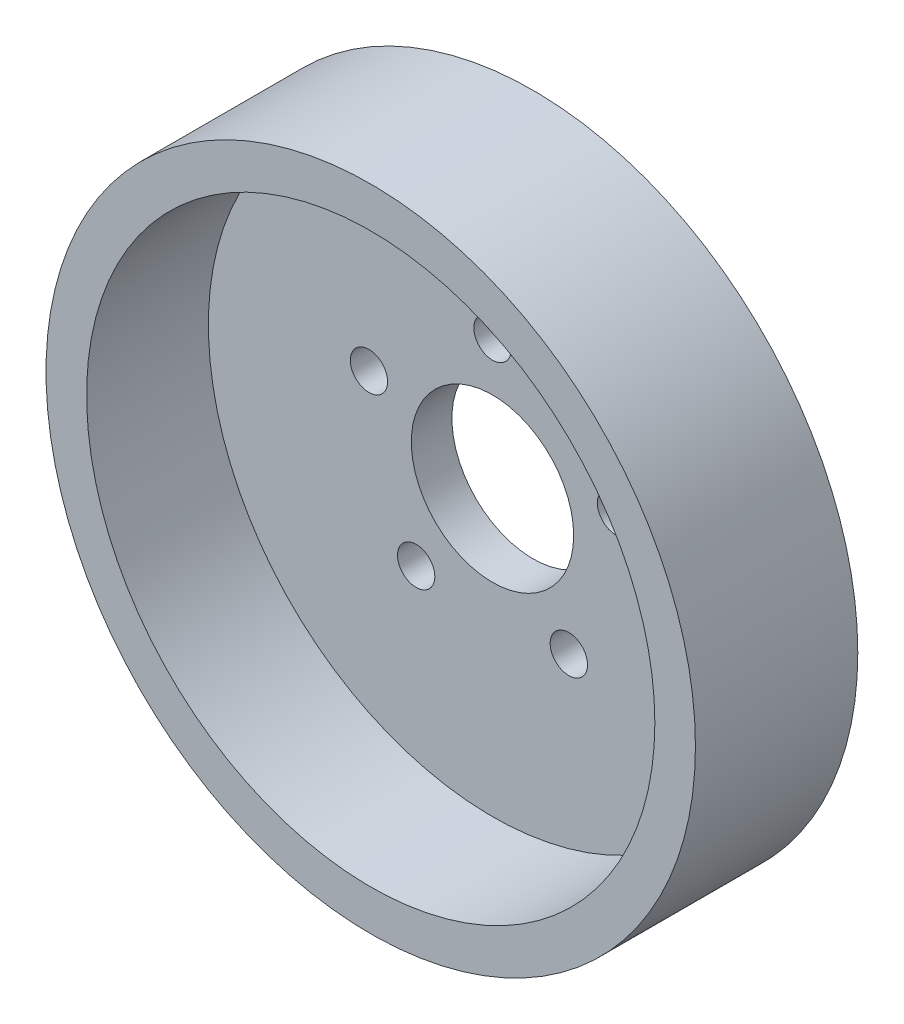
ISO-10303-21;
HEADER;
FILE_DESCRIPTION(('STEP AP214'),'2;1');
FILE_NAME('part.step','',(''),(''),'','','');
FILE_SCHEMA(('AUTOMOTIVE_DESIGN { 1 0 10303 214 1 1 1 1 }'));
ENDSEC;
DATA;
#1=APPLICATION_CONTEXT('core data for automotive mechanical design processes');
#2=APPLICATION_PROTOCOL_DEFINITION('international standard','automotive_design',2000,#1);
#3=PRODUCT_CONTEXT('',#1,'mechanical');
#4=PRODUCT('Part','Part','',(#3));
#5=PRODUCT_RELATED_PRODUCT_CATEGORY('part','',(#4));
#6=PRODUCT_DEFINITION_FORMATION('','',#4);
#7=PRODUCT_DEFINITION_CONTEXT('part definition',#1,'design');
#8=PRODUCT_DEFINITION('design','',#6,#7);
#9=PRODUCT_DEFINITION_SHAPE('','',#8);
#10=(LENGTH_UNIT() NAMED_UNIT(*) SI_UNIT(.MILLI.,.METRE.));
#11=(NAMED_UNIT(*) PLANE_ANGLE_UNIT() SI_UNIT($,.RADIAN.));
#12=(NAMED_UNIT(*) SI_UNIT($,.STERADIAN.) SOLID_ANGLE_UNIT());
#13=UNCERTAINTY_MEASURE_WITH_UNIT(LENGTH_MEASURE(1.E-05),#10,'distance_accuracy_value','');
#14=(GEOMETRIC_REPRESENTATION_CONTEXT(3) GLOBAL_UNCERTAINTY_ASSIGNED_CONTEXT((#13)) GLOBAL_UNIT_ASSIGNED_CONTEXT((#10,
#11,#12)) REPRESENTATION_CONTEXT('',''));
#15=CARTESIAN_POINT('',(0.,0.,0.));
#16=DIRECTION('',(0.,0.,1.));
#17=DIRECTION('',(1.,0.,0.));
#18=AXIS2_PLACEMENT_3D('',#15,#16,#17);
#19=CARTESIAN_POINT('',(0.,0.,25.4));
#20=DIRECTION('',(0.,0.,-1.));
#21=DIRECTION('',(-1.,0.,0.));
#22=AXIS2_PLACEMENT_3D('',#19,#20,#21);
#23=CYLINDRICAL_SURFACE('',#22,12.7);
#24=CARTESIAN_POINT('',(0.,0.,0.));
#25=DIRECTION('',(0.,0.,1.));
#26=DIRECTION('',(1.,0.,0.));
#27=AXIS2_PLACEMENT_3D('',#24,#25,#26);
#28=CIRCLE('',#27,12.7);
#29=CARTESIAN_POINT('',(12.7,0.,0.));
#30=VERTEX_POINT('',#29);
#31=EDGE_CURVE('E52',#30,#30,#28,.T.);
#32=ORIENTED_EDGE('',*,*,#31,.F.);
#33=EDGE_LOOP('',(#32));
#34=FACE_BOUND('',#33,.T.);
#35=CARTESIAN_POINT('',(0.,0.,6.35));
#36=DIRECTION('',(0.,0.,1.));
#37=DIRECTION('',(1.,0.,0.));
#38=AXIS2_PLACEMENT_3D('',#35,#36,#37);
#39=CIRCLE('',#38,12.7);
#40=CARTESIAN_POINT('',(12.7,0.,6.35));
#41=VERTEX_POINT('',#40);
#42=EDGE_CURVE('E77',#41,#41,#39,.T.);
#43=ORIENTED_EDGE('',*,*,#42,.T.);
#44=EDGE_LOOP('',(#43));
#45=FACE_BOUND('',#44,.T.);
#46=ADVANCED_FACE('F37',(#34,#45),#23,.F.);
#47=CARTESIAN_POINT('',(0.,20.32,25.4));
#48=DIRECTION('',(0.,0.,-1.));
#49=DIRECTION('',(-1.,0.,0.));
#50=AXIS2_PLACEMENT_3D('',#47,#48,#49);
#51=CYLINDRICAL_SURFACE('',#50,2.921);
#52=CARTESIAN_POINT('',(0.,20.32,0.));
#53=DIRECTION('',(0.,0.,1.));
#54=DIRECTION('',(1.,0.,0.));
#55=AXIS2_PLACEMENT_3D('',#52,#53,#54);
#56=CIRCLE('',#55,2.921);
#57=CARTESIAN_POINT('',(2.921,20.32,0.));
#58=VERTEX_POINT('',#57);
#59=EDGE_CURVE('E57',#58,#58,#56,.T.);
#60=ORIENTED_EDGE('',*,*,#59,.F.);
#61=EDGE_LOOP('',(#60));
#62=FACE_BOUND('',#61,.T.);
#63=CARTESIAN_POINT('',(0.,20.32,6.35));
#64=DIRECTION('',(0.,0.,1.));
#65=DIRECTION('',(1.,0.,0.));
#66=AXIS2_PLACEMENT_3D('',#63,#64,#65);
#67=CIRCLE('',#66,2.921);
#68=CARTESIAN_POINT('',(2.921,20.32,6.35));
#69=VERTEX_POINT('',#68);
#70=EDGE_CURVE('E81',#69,#69,#67,.T.);
#71=ORIENTED_EDGE('',*,*,#70,.T.);
#72=EDGE_LOOP('',(#71));
#73=FACE_BOUND('',#72,.T.);
#74=ADVANCED_FACE('F125',(#62,#73),#51,.F.);
#75=CARTESIAN_POINT('',(19.3254684111175,6.27922532569893,25.4));
#76=DIRECTION('',(0.,0.,-1.));
#77=DIRECTION('',(-1.,0.,0.));
#78=AXIS2_PLACEMENT_3D('',#75,#76,#77);
#79=CYLINDRICAL_SURFACE('',#78,2.921);
#80=CARTESIAN_POINT('',(19.3254684111175,6.27922532569893,0.));
#81=DIRECTION('',(0.,0.,1.));
#82=DIRECTION('',(1.,0.,0.));
#83=AXIS2_PLACEMENT_3D('',#80,#81,#82);
#84=CIRCLE('',#83,2.921);
#85=CARTESIAN_POINT('',(22.2464684111175,6.27922532569893,0.));
#86=VERTEX_POINT('',#85);
#87=EDGE_CURVE('E61',#86,#86,#84,.T.);
#88=ORIENTED_EDGE('',*,*,#87,.F.);
#89=EDGE_LOOP('',(#88));
#90=FACE_BOUND('',#89,.T.);
#91=CARTESIAN_POINT('',(19.3254684111175,6.27922532569893,6.35));
#92=DIRECTION('',(0.,0.,1.));
#93=DIRECTION('',(1.,0.,0.));
#94=AXIS2_PLACEMENT_3D('',#91,#92,#93);
#95=CIRCLE('',#94,2.921);
#96=CARTESIAN_POINT('',(22.2464684111175,6.27922532569893,6.35));
#97=VERTEX_POINT('',#96);
#98=EDGE_CURVE('E85',#97,#97,#95,.T.);
#99=ORIENTED_EDGE('',*,*,#98,.T.);
#100=EDGE_LOOP('',(#99));
#101=FACE_BOUND('',#100,.T.);
#102=ADVANCED_FACE('F131',(#90,#101),#79,.F.);
#103=CARTESIAN_POINT('',(11.9437963265831,-16.4392253256989,25.4));
#104=DIRECTION('',(0.,0.,-1.));
#105=DIRECTION('',(-1.,0.,0.));
#106=AXIS2_PLACEMENT_3D('',#103,#104,#105);
#107=CYLINDRICAL_SURFACE('',#106,2.921);
#108=CARTESIAN_POINT('',(11.9437963265831,-16.4392253256989,0.));
#109=DIRECTION('',(0.,0.,1.));
#110=DIRECTION('',(1.,0.,0.));
#111=AXIS2_PLACEMENT_3D('',#108,#109,#110);
#112=CIRCLE('',#111,2.921);
#113=CARTESIAN_POINT('',(14.8647963265831,-16.4392253256989,0.));
#114=VERTEX_POINT('',#113);
#115=EDGE_CURVE('E65',#114,#114,#112,.T.);
#116=ORIENTED_EDGE('',*,*,#115,.F.);
#117=EDGE_LOOP('',(#116));
#118=FACE_BOUND('',#117,.T.);
#119=CARTESIAN_POINT('',(11.9437963265831,-16.4392253256989,6.35));
#120=DIRECTION('',(0.,0.,1.));
#121=DIRECTION('',(1.,0.,0.));
#122=AXIS2_PLACEMENT_3D('',#119,#120,#121);
#123=CIRCLE('',#122,2.921);
#124=CARTESIAN_POINT('',(14.8647963265831,-16.4392253256989,6.35));
#125=VERTEX_POINT('',#124);
#126=EDGE_CURVE('E89',#125,#125,#123,.T.);
#127=ORIENTED_EDGE('',*,*,#126,.T.);
#128=EDGE_LOOP('',(#127));
#129=FACE_BOUND('',#128,.T.);
#130=ADVANCED_FACE('F167',(#118,#129),#107,.F.);
#131=CARTESIAN_POINT('',(-11.9437963265831,-16.4392253256989,25.4));
#132=DIRECTION('',(0.,0.,-1.));
#133=DIRECTION('',(-1.,0.,0.));
#134=AXIS2_PLACEMENT_3D('',#131,#132,#133);
#135=CYLINDRICAL_SURFACE('',#134,2.921);
#136=CARTESIAN_POINT('',(-11.9437963265831,-16.4392253256989,0.));
#137=DIRECTION('',(0.,0.,1.));
#138=DIRECTION('',(1.,0.,0.));
#139=AXIS2_PLACEMENT_3D('',#136,#137,#138);
#140=CIRCLE('',#139,2.921);
#141=CARTESIAN_POINT('',(-9.02279632658306,-16.4392253256989,0.));
#142=VERTEX_POINT('',#141);
#143=EDGE_CURVE('E69',#142,#142,#140,.T.);
#144=ORIENTED_EDGE('',*,*,#143,.F.);
#145=EDGE_LOOP('',(#144));
#146=FACE_BOUND('',#145,.T.);
#147=CARTESIAN_POINT('',(-11.9437963265831,-16.4392253256989,6.35));
#148=DIRECTION('',(0.,0.,1.));
#149=DIRECTION('',(1.,0.,0.));
#150=AXIS2_PLACEMENT_3D('',#147,#148,#149);
#151=CIRCLE('',#150,2.921);
#152=CARTESIAN_POINT('',(-9.02279632658306,-16.4392253256989,6.35));
#153=VERTEX_POINT('',#152);
#154=EDGE_CURVE('E93',#153,#153,#151,.T.);
#155=ORIENTED_EDGE('',*,*,#154,.T.);
#156=EDGE_LOOP('',(#155));
#157=FACE_BOUND('',#156,.T.);
#158=ADVANCED_FACE('F162',(#146,#157),#135,.F.);
#159=CARTESIAN_POINT('',(-19.3254684111175,6.27922532569893,25.4));
#160=DIRECTION('',(0.,0.,-1.));
#161=DIRECTION('',(-1.,0.,0.));
#162=AXIS2_PLACEMENT_3D('',#159,#160,#161);
#163=CYLINDRICAL_SURFACE('',#162,2.921);
#164=CARTESIAN_POINT('',(-19.3254684111175,6.27922532569893,0.));
#165=DIRECTION('',(0.,0.,1.));
#166=DIRECTION('',(1.,0.,0.));
#167=AXIS2_PLACEMENT_3D('',#164,#165,#166);
#168=CIRCLE('',#167,2.921);
#169=CARTESIAN_POINT('',(-16.4044684111175,6.27922532569893,0.));
#170=VERTEX_POINT('',#169);
#171=EDGE_CURVE('E73',#170,#170,#168,.T.);
#172=ORIENTED_EDGE('',*,*,#171,.F.);
#173=EDGE_LOOP('',(#172));
#174=FACE_BOUND('',#173,.T.);
#175=CARTESIAN_POINT('',(-19.3254684111175,6.27922532569893,6.35));
#176=DIRECTION('',(0.,0.,1.));
#177=DIRECTION('',(1.,0.,0.));
#178=AXIS2_PLACEMENT_3D('',#175,#176,#177);
#179=CIRCLE('',#178,2.921);
#180=CARTESIAN_POINT('',(-16.4044684111175,6.27922532569893,6.35));
#181=VERTEX_POINT('',#180);
#182=EDGE_CURVE('E41',#181,#181,#179,.T.);
#183=ORIENTED_EDGE('',*,*,#182,.T.);
#184=EDGE_LOOP('',(#183));
#185=FACE_BOUND('',#184,.T.);
#186=ADVANCED_FACE('F110',(#174,#185),#163,.F.);
#187=CARTESIAN_POINT('',(0.,0.,25.4));
#188=DIRECTION('',(0.,0.,1.));
#189=DIRECTION('',(1.,0.,0.));
#190=AXIS2_PLACEMENT_3D('',#187,#188,#189);
#191=PLANE('',#190);
#192=CARTESIAN_POINT('',(0.,0.,25.4));
#193=DIRECTION('',(0.,0.,1.));
#194=DIRECTION('',(1.,0.,0.));
#195=AXIS2_PLACEMENT_3D('',#192,#193,#194);
#196=CIRCLE('',#195,44.45);
#197=CARTESIAN_POINT('',(44.45,0.,25.4));
#198=VERTEX_POINT('',#197);
#199=EDGE_CURVE('E97',#198,#198,#196,.T.);
#200=ORIENTED_EDGE('',*,*,#199,.F.);
#201=EDGE_LOOP('',(#200));
#202=FACE_BOUND('',#201,.T.);
#203=CARTESIAN_POINT('',(0.,0.,25.4));
#204=DIRECTION('',(0.,0.,1.));
#205=DIRECTION('',(1.,0.,0.));
#206=AXIS2_PLACEMENT_3D('',#203,#204,#205);
#207=CIRCLE('',#206,50.8);
#208=CARTESIAN_POINT('',(50.8,0.,25.4));
#209=VERTEX_POINT('',#208);
#210=EDGE_CURVE('E10',#209,#209,#207,.T.);
#211=ORIENTED_EDGE('',*,*,#210,.T.);
#212=EDGE_LOOP('',(#211));
#213=FACE_BOUND('',#212,.T.);
#214=ADVANCED_FACE('F138',(#202,#213),#191,.T.);
#215=CARTESIAN_POINT('',(0.,0.,0.));
#216=DIRECTION('',(0.,0.,1.));
#217=DIRECTION('',(1.,0.,0.));
#218=AXIS2_PLACEMENT_3D('',#215,#216,#217);
#219=PLANE('',#218);
#220=CARTESIAN_POINT('',(0.,0.,0.));
#221=DIRECTION('',(0.,0.,1.));
#222=DIRECTION('',(1.,0.,0.));
#223=AXIS2_PLACEMENT_3D('',#220,#221,#222);
#224=CIRCLE('',#223,50.8);
#225=CARTESIAN_POINT('',(50.8,0.,0.));
#226=VERTEX_POINT('',#225);
#227=EDGE_CURVE('E46',#226,#226,#224,.T.);
#228=ORIENTED_EDGE('',*,*,#227,.F.);
#229=EDGE_LOOP('',(#228));
#230=FACE_BOUND('',#229,.T.);
#231=ORIENTED_EDGE('',*,*,#31,.T.);
#232=EDGE_LOOP('',(#231));
#233=FACE_BOUND('',#232,.T.);
#234=ORIENTED_EDGE('',*,*,#59,.T.);
#235=EDGE_LOOP('',(#234));
#236=FACE_BOUND('',#235,.T.);
#237=ORIENTED_EDGE('',*,*,#87,.T.);
#238=EDGE_LOOP('',(#237));
#239=FACE_BOUND('',#238,.T.);
#240=ORIENTED_EDGE('',*,*,#115,.T.);
#241=EDGE_LOOP('',(#240));
#242=FACE_BOUND('',#241,.T.);
#243=ORIENTED_EDGE('',*,*,#143,.T.);
#244=EDGE_LOOP('',(#243));
#245=FACE_BOUND('',#244,.T.);
#246=ORIENTED_EDGE('',*,*,#171,.T.);
#247=EDGE_LOOP('',(#246));
#248=FACE_BOUND('',#247,.T.);
#249=ADVANCED_FACE('F140',(#230,#233,#236,#239,#242,#245,#248),#219,.F.);
#250=CARTESIAN_POINT('',(0.,0.,25.4));
#251=DIRECTION('',(0.,0.,-1.));
#252=DIRECTION('',(-1.,0.,0.));
#253=AXIS2_PLACEMENT_3D('',#250,#251,#252);
#254=CYLINDRICAL_SURFACE('',#253,50.8);
#255=ORIENTED_EDGE('',*,*,#210,.F.);
#256=EDGE_LOOP('',(#255));
#257=FACE_BOUND('',#256,.T.);
#258=ORIENTED_EDGE('',*,*,#227,.T.);
#259=EDGE_LOOP('',(#258));
#260=FACE_BOUND('',#259,.T.);
#261=ADVANCED_FACE('F39',(#257,#260),#254,.T.);
#262=CARTESIAN_POINT('',(0.,0.,6.35));
#263=DIRECTION('',(0.,0.,1.));
#264=DIRECTION('',(1.,0.,0.));
#265=AXIS2_PLACEMENT_3D('',#262,#263,#264);
#266=CYLINDRICAL_SURFACE('',#265,44.45);
#267=CARTESIAN_POINT('',(0.,0.,6.35));
#268=DIRECTION('',(0.,0.,1.));
#269=DIRECTION('',(1.,0.,0.));
#270=AXIS2_PLACEMENT_3D('',#267,#268,#269);
#271=CIRCLE('',#270,44.45);
#272=CARTESIAN_POINT('',(44.45,0.,6.35));
#273=VERTEX_POINT('',#272);
#274=EDGE_CURVE('E101',#273,#273,#271,.T.);
#275=CARTESIAN_POINT('',(44.45,0.,6.35));
#276=CARTESIAN_POINT('',(44.45,0.,6.5484375));
#277=CARTESIAN_POINT('',(44.45,0.,6.746875));
#278=CARTESIAN_POINT('',(44.45,0.,7.14375));
#279=CARTESIAN_POINT('',(44.45,0.,7.3421875));
#280=CARTESIAN_POINT('',(44.45,0.,7.7390625));
#281=CARTESIAN_POINT('',(44.45,0.,7.9375));
#282=CARTESIAN_POINT('',(44.45,0.,8.334375));
#283=CARTESIAN_POINT('',(44.45,0.,8.5328125));
#284=CARTESIAN_POINT('',(44.45,0.,8.9296875));
#285=CARTESIAN_POINT('',(44.45,0.,9.128125));
#286=CARTESIAN_POINT('',(44.45,0.,9.525));
#287=CARTESIAN_POINT('',(44.45,0.,9.7234375));
#288=CARTESIAN_POINT('',(44.45,0.,10.1203125));
#289=CARTESIAN_POINT('',(44.45,0.,10.31875));
#290=CARTESIAN_POINT('',(44.45,0.,10.715625));
#291=CARTESIAN_POINT('',(44.45,0.,10.9140625));
#292=CARTESIAN_POINT('',(44.45,0.,11.3109375));
#293=CARTESIAN_POINT('',(44.45,0.,11.509375));
#294=CARTESIAN_POINT('',(44.45,0.,11.90625));
#295=CARTESIAN_POINT('',(44.45,0.,12.1046875));
#296=CARTESIAN_POINT('',(44.45,0.,12.5015625));
#297=CARTESIAN_POINT('',(44.45,0.,12.7));
#298=CARTESIAN_POINT('',(44.45,0.,13.096875));
#299=CARTESIAN_POINT('',(44.45,0.,13.2953125));
#300=CARTESIAN_POINT('',(44.45,0.,13.6921875));
#301=CARTESIAN_POINT('',(44.45,0.,13.890625));
#302=CARTESIAN_POINT('',(44.45,0.,14.2875));
#303=CARTESIAN_POINT('',(44.45,0.,14.4859375));
#304=CARTESIAN_POINT('',(44.45,0.,14.8828125));
#305=CARTESIAN_POINT('',(44.45,0.,15.08125));
#306=CARTESIAN_POINT('',(44.45,0.,15.478125));
#307=CARTESIAN_POINT('',(44.45,0.,15.6765625));
#308=CARTESIAN_POINT('',(44.45,0.,16.0734375));
#309=CARTESIAN_POINT('',(44.45,0.,16.271875));
#310=CARTESIAN_POINT('',(44.45,0.,16.66875));
#311=CARTESIAN_POINT('',(44.45,0.,16.8671875));
#312=CARTESIAN_POINT('',(44.45,0.,17.2640625));
#313=CARTESIAN_POINT('',(44.45,0.,17.4625));
#314=CARTESIAN_POINT('',(44.45,0.,17.859375));
#315=CARTESIAN_POINT('',(44.45,0.,18.0578125));
#316=CARTESIAN_POINT('',(44.45,0.,18.4546875));
#317=CARTESIAN_POINT('',(44.45,0.,18.653125));
#318=CARTESIAN_POINT('',(44.45,0.,19.05));
#319=CARTESIAN_POINT('',(44.45,0.,19.2484375));
#320=CARTESIAN_POINT('',(44.45,0.,19.6453125));
#321=CARTESIAN_POINT('',(44.45,0.,19.84375));
#322=CARTESIAN_POINT('',(44.45,0.,20.240625));
#323=CARTESIAN_POINT('',(44.45,0.,20.4390625));
#324=CARTESIAN_POINT('',(44.45,0.,20.8359375));
#325=CARTESIAN_POINT('',(44.45,0.,21.034375));
#326=CARTESIAN_POINT('',(44.45,0.,21.43125));
#327=CARTESIAN_POINT('',(44.45,0.,21.6296875));
#328=CARTESIAN_POINT('',(44.45,0.,22.0265625));
#329=CARTESIAN_POINT('',(44.45,0.,22.225));
#330=CARTESIAN_POINT('',(44.45,0.,22.621875));
#331=CARTESIAN_POINT('',(44.45,0.,22.8203125));
#332=CARTESIAN_POINT('',(44.45,0.,23.2171875));
#333=CARTESIAN_POINT('',(44.45,0.,23.415625));
#334=CARTESIAN_POINT('',(44.45,0.,23.8125));
#335=CARTESIAN_POINT('',(44.45,0.,24.0109375));
#336=CARTESIAN_POINT('',(44.45,0.,24.4078125));
#337=CARTESIAN_POINT('',(44.45,0.,24.60625));
#338=CARTESIAN_POINT('',(44.45,0.,25.003125));
#339=CARTESIAN_POINT('',(44.45,0.,25.2015625));
#340=CARTESIAN_POINT('',(44.45,0.,25.4));
#341=B_SPLINE_CURVE_WITH_KNOTS('',3,(#275,#276,#277,#278,#279,#280,#281,#282,#283,#284,#285,
#286,#287,#288,#289,#290,#291,#292,#293,#294,#295,#296,#297,#298,#299,#300,#301,#302,#303,#304,
#305,#306,#307,#308,#309,#310,#311,#312,#313,#314,#315,#316,#317,#318,#319,#320,#321,#322,#323,
#324,#325,#326,#327,#328,#329,#330,#331,#332,#333,#334,#335,#336,#337,#338,#339,#340),
.UNSPECIFIED.,.F.,.F.,(4,2,2,2,2,2,2,2,2,2,2,2,2,2,2,2,2,2,2,2,2,2,2,2,2,2,2,2,2,2,2,2,4),(0.,
0.5953125,1.190625,1.7859375,2.38125,2.9765625,3.571875,4.1671875,4.7625,5.3578125,5.953125,
6.5484375,7.14375,7.7390625,8.334375,8.9296875,9.525,10.1203125,10.715625,11.3109375,11.90625,
12.5015625,13.096875,13.6921875,14.2875,14.8828125,15.478125,16.0734375,16.66875,17.2640625,
17.859375,18.4546875,19.05),.UNSPECIFIED.);
#342=EDGE_CURVE('BSEAM114',#273,#198,#341,.T.);
#343=ORIENTED_EDGE('',*,*,#274,.F.);
#344=ORIENTED_EDGE('',*,*,#199,.T.);
#345=ORIENTED_EDGE('',*,*,#342,.T.);
#346=ORIENTED_EDGE('',*,*,#342,.F.);
#347=EDGE_LOOP('',(#343,#345,#344,#346));
#348=FACE_BOUND('',#347,.T.);
#349=ADVANCED_FACE('F114',(#348),#266,.F.);
#350=CARTESIAN_POINT('',(0.,0.,6.35));
#351=DIRECTION('',(0.,0.,1.));
#352=DIRECTION('',(1.,0.,0.));
#353=AXIS2_PLACEMENT_3D('',#350,#351,#352);
#354=PLANE('',#353);
#355=ORIENTED_EDGE('',*,*,#42,.F.);
#356=EDGE_LOOP('',(#355));
#357=FACE_BOUND('',#356,.T.);
#358=ORIENTED_EDGE('',*,*,#70,.F.);
#359=EDGE_LOOP('',(#358));
#360=FACE_BOUND('',#359,.T.);
#361=ORIENTED_EDGE('',*,*,#98,.F.);
#362=EDGE_LOOP('',(#361));
#363=FACE_BOUND('',#362,.T.);
#364=ORIENTED_EDGE('',*,*,#126,.F.);
#365=EDGE_LOOP('',(#364));
#366=FACE_BOUND('',#365,.T.);
#367=ORIENTED_EDGE('',*,*,#154,.F.);
#368=EDGE_LOOP('',(#367));
#369=FACE_BOUND('',#368,.T.);
#370=ORIENTED_EDGE('',*,*,#182,.F.);
#371=EDGE_LOOP('',(#370));
#372=FACE_BOUND('',#371,.T.);
#373=ORIENTED_EDGE('',*,*,#274,.T.);
#374=EDGE_LOOP('',(#373));
#375=FACE_BOUND('',#374,.T.);
#376=ADVANCED_FACE('F112',(#357,#360,#363,#366,#369,#372,#375),#354,.T.);
#377=CLOSED_SHELL('',(#46,#74,#102,#130,#158,#186,#214,#249,#261,#349,#376));
#378=MANIFOLD_SOLID_BREP('B2',#377);
#379=ADVANCED_BREP_SHAPE_REPRESENTATION('',(#18,#378),#14);
#380=SHAPE_DEFINITION_REPRESENTATION(#9,#379);
ENDSEC;
END-ISO-10303-21;
